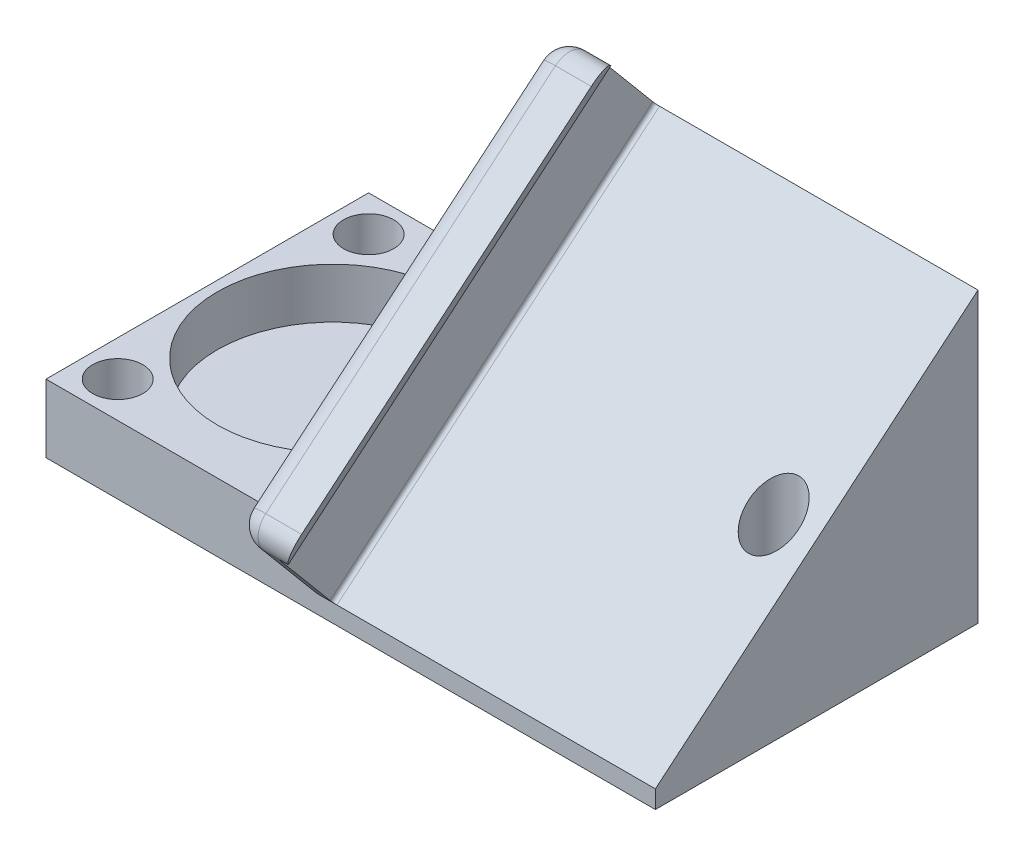
ISO-10303-21;
HEADER;
FILE_DESCRIPTION(('STEP AP214'),'2;1');
FILE_NAME('part.step','',(''),(''),'','','');
FILE_SCHEMA(('AUTOMOTIVE_DESIGN { 1 0 10303 214 1 1 1 1 }'));
ENDSEC;
DATA;
#1=APPLICATION_CONTEXT('core data for automotive mechanical design processes');
#2=APPLICATION_PROTOCOL_DEFINITION('international standard','automotive_design',2000,#1);
#3=PRODUCT_CONTEXT('',#1,'mechanical');
#4=PRODUCT('Part','Part','',(#3));
#5=PRODUCT_RELATED_PRODUCT_CATEGORY('part','',(#4));
#6=PRODUCT_DEFINITION_FORMATION('','',#4);
#7=PRODUCT_DEFINITION_CONTEXT('part definition',#1,'design');
#8=PRODUCT_DEFINITION('design','',#6,#7);
#9=PRODUCT_DEFINITION_SHAPE('','',#8);
#10=(LENGTH_UNIT() NAMED_UNIT(*) SI_UNIT(.MILLI.,.METRE.));
#11=(NAMED_UNIT(*) PLANE_ANGLE_UNIT() SI_UNIT($,.RADIAN.));
#12=(NAMED_UNIT(*) SI_UNIT($,.STERADIAN.) SOLID_ANGLE_UNIT());
#13=UNCERTAINTY_MEASURE_WITH_UNIT(LENGTH_MEASURE(1.E-05),#10,'distance_accuracy_value','');
#14=(GEOMETRIC_REPRESENTATION_CONTEXT(3) GLOBAL_UNCERTAINTY_ASSIGNED_CONTEXT((#13)) GLOBAL_UNIT_ASSIGNED_CONTEXT((#10,
#11,#12)) REPRESENTATION_CONTEXT('',''));
#15=CARTESIAN_POINT('',(0.,0.,0.));
#16=DIRECTION('',(0.,0.,1.));
#17=DIRECTION('',(1.,0.,0.));
#18=AXIS2_PLACEMENT_3D('',#15,#16,#17);
#19=CARTESIAN_POINT('',(-50.,0.,0.));
#20=DIRECTION('',(1.,0.,0.));
#21=DIRECTION('',(0.,0.,-1.));
#22=AXIS2_PLACEMENT_3D('',#19,#20,#21);
#23=PLANE('',#22);
#24=DIRECTION('',(0.,-1.,0.));
#25=VECTOR('',#24,1.);
#26=CARTESIAN_POINT('',(-50.,9.5,0.));
#27=LINE('',#26,#25);
#28=CARTESIAN_POINT('',(-50.,9.5,0.));
#29=VERTEX_POINT('',#28);
#30=CARTESIAN_POINT('',(-50.,7.16717148058123,0.));
#31=VERTEX_POINT('',#30);
#32=EDGE_CURVE('E227',#29,#31,#27,.T.);
#33=ORIENTED_EDGE('',*,*,#32,.T.);
#34=DIRECTION('',(0.,-0.766044443118981,-0.642787609686535));
#35=VECTOR('',#34,1.);
#36=CARTESIAN_POINT('',(-50.,2.96130260697592,-3.52914302062219));
#37=LINE('',#36,#35);
#38=CARTESIAN_POINT('',(-50.,13.6208961464873,5.41531798688147));
#39=VERTEX_POINT('',#38);
#40=EDGE_CURVE('E337',#31,#39,#37,.F.);
#41=ORIENTED_EDGE('',*,*,#40,.T.);
#42=DIRECTION('',(0.,0.642787609686535,-0.766044443118982));
#43=VECTOR('',#42,1.);
#44=CARTESIAN_POINT('',(-50.,10.6595935395114,8.94446100750366));
#45=LINE('',#44,#43);
#46=CARTESIAN_POINT('',(-50.,47.5236538913454,-34.9884153544047));
#47=VERTEX_POINT('',#46);
#48=EDGE_CURVE('E273',#39,#47,#45,.T.);
#49=ORIENTED_EDGE('',*,*,#48,.T.);
#50=DIRECTION('',(0.,-0.766044443118981,-0.642787609686535));
#51=VECTOR('',#50,1.);
#52=CARTESIAN_POINT('',(-50.,38.3311205739176,-42.7018666706431));
#53=LINE('',#52,#51);
#54=CARTESIAN_POINT('',(-50.,39.1675727001786,-42.));
#55=VERTEX_POINT('',#54);
#56=EDGE_CURVE('E311',#47,#55,#53,.T.);
#57=ORIENTED_EDGE('',*,*,#56,.T.);
#58=DIRECTION('',(0.,1.,0.));
#59=VECTOR('',#58,1.);
#60=CARTESIAN_POINT('',(-50.,0.,-42.));
#61=LINE('',#60,#59);
#62=CARTESIAN_POINT('',(-50.,9.5,-42.));
#63=VERTEX_POINT('',#62);
#64=EDGE_CURVE('E309',#55,#63,#61,.F.);
#65=ORIENTED_EDGE('',*,*,#64,.T.);
#66=DIRECTION('',(0.,0.,-1.));
#67=VECTOR('',#66,1.);
#68=CARTESIAN_POINT('',(-50.,9.5,0.));
#69=LINE('',#68,#67);
#70=EDGE_CURVE('E221',#29,#63,#69,.T.);
#71=ORIENTED_EDGE('',*,*,#70,.F.);
#72=EDGE_LOOP('',(#33,#41,#49,#57,#65,#71));
#73=FACE_BOUND('',#72,.T.);
#74=ADVANCED_FACE('F90',(#73),#23,.F.);
#75=CARTESIAN_POINT('',(-50.,2.5,0.));
#76=DIRECTION('',(0.,0.766044443118982,0.642787609686535));
#77=DIRECTION('',(0.,-0.642787609686535,0.766044443118982));
#78=AXIS2_PLACEMENT_3D('',#75,#76,#77);
#79=PLANE('',#78);
#80=CARTESIAN_POINT('',(-6.,21.3797417014886,-22.5));
#81=DIRECTION('',(0.,0.766044443118982,0.642787609686535));
#82=DIRECTION('',(0.,-0.642787609686535,0.766044443118982));
#83=AXIS2_PLACEMENT_3D('',#80,#81,#82);
#84=ELLIPSE('',#83,4.56892551266295,3.5);
#85=CARTESIAN_POINT('',(-6.,18.4428929923681,-19.));
#86=VERTEX_POINT('',#85);
#87=EDGE_CURVE('E287',#86,#86,#84,.F.);
#88=ORIENTED_EDGE('',*,*,#87,.T.);
#89=EDGE_LOOP('',(#88));
#90=FACE_BOUND('',#89,.T.);
#91=DIRECTION('',(1.,0.,0.));
#92=VECTOR('',#91,1.);
#93=CARTESIAN_POINT('',(-50.,40.2594834029772,-45.));
#94=LINE('',#93,#92);
#95=CARTESIAN_POINT('',(-44.42,40.2594834029772,-45.));
#96=VERTEX_POINT('',#95);
#97=CARTESIAN_POINT('',(0.,40.2594834029772,-45.));
#98=VERTEX_POINT('',#97);
#99=EDGE_CURVE('E251',#96,#98,#94,.T.);
#100=ORIENTED_EDGE('',*,*,#99,.F.);
#101=DIRECTION('',(0.,0.642787609686535,-0.766044443118982));
#102=VECTOR('',#101,1.);
#103=CARTESIAN_POINT('',(-44.42,2.5,0.));
#104=LINE('',#103,#102);
#105=CARTESIAN_POINT('',(-44.42,2.5,0.));
#106=VERTEX_POINT('',#105);
#107=EDGE_CURVE('E354',#96,#106,#104,.F.);
#108=ORIENTED_EDGE('',*,*,#107,.T.);
#109=DIRECTION('',(1.,0.,0.));
#110=VECTOR('',#109,1.);
#111=CARTESIAN_POINT('',(-50.,2.5,0.));
#112=LINE('',#111,#110);
#113=CARTESIAN_POINT('',(0.,2.5,0.));
#114=VERTEX_POINT('',#113);
#115=EDGE_CURVE('E256',#106,#114,#112,.T.);
#116=ORIENTED_EDGE('',*,*,#115,.T.);
#117=DIRECTION('',(0.,-0.642787609686535,0.766044443118982));
#118=VECTOR('',#117,1.);
#119=CARTESIAN_POINT('',(0.,2.5,0.));
#120=LINE('',#119,#118);
#121=EDGE_CURVE('E248',#98,#114,#120,.T.);
#122=ORIENTED_EDGE('',*,*,#121,.F.);
#123=EDGE_LOOP('',(#100,#108,#116,#122));
#124=FACE_BOUND('',#123,.T.);
#125=ADVANCED_FACE('F372',(#90,#124),#79,.T.);
#126=CARTESIAN_POINT('',(0.,2.5,0.));
#127=DIRECTION('',(-1.,0.,0.));
#128=DIRECTION('',(0.,0.,1.));
#129=AXIS2_PLACEMENT_3D('',#126,#127,#128);
#130=PLANE('',#129);
#131=DIRECTION('',(0.,0.,-1.));
#132=VECTOR('',#131,1.);
#133=CARTESIAN_POINT('',(0.,0.,0.));
#134=LINE('',#133,#132);
#135=CARTESIAN_POINT('',(0.,0.,0.));
#136=VERTEX_POINT('',#135);
#137=CARTESIAN_POINT('',(0.,0.,-45.));
#138=VERTEX_POINT('',#137);
#139=EDGE_CURVE('E255',#136,#138,#134,.T.);
#140=ORIENTED_EDGE('',*,*,#139,.T.);
#141=DIRECTION('',(0.,-1.,0.));
#142=VECTOR('',#141,1.);
#143=CARTESIAN_POINT('',(0.,2.5,-45.));
#144=LINE('',#143,#142);
#145=EDGE_CURVE('E208',#98,#138,#144,.T.);
#146=ORIENTED_EDGE('',*,*,#145,.F.);
#147=ORIENTED_EDGE('',*,*,#121,.T.);
#148=DIRECTION('',(0.,-1.,0.));
#149=VECTOR('',#148,1.);
#150=CARTESIAN_POINT('',(0.,2.5,0.));
#151=LINE('',#150,#149);
#152=EDGE_CURVE('E265',#114,#136,#151,.T.);
#153=ORIENTED_EDGE('',*,*,#152,.T.);
#154=EDGE_LOOP('',(#140,#146,#147,#153));
#155=FACE_BOUND('',#154,.T.);
#156=ADVANCED_FACE('F382',(#155),#130,.F.);
#157=CARTESIAN_POINT('',(0.,2.5,-45.));
#158=DIRECTION('',(0.,0.,1.));
#159=DIRECTION('',(1.,0.,0.));
#160=AXIS2_PLACEMENT_3D('',#157,#158,#159);
#161=PLANE('',#160);
#162=DIRECTION('',(-1.,0.,0.));
#163=VECTOR('',#162,1.);
#164=CARTESIAN_POINT('',(0.,9.5,-45.));
#165=LINE('',#164,#163);
#166=CARTESIAN_POINT('',(-47.,9.5,-45.));
#167=VERTEX_POINT('',#166);
#168=CARTESIAN_POINT('',(-85.,9.5,-45.));
#169=VERTEX_POINT('',#168);
#170=EDGE_CURVE('E201',#167,#169,#165,.T.);
#171=ORIENTED_EDGE('',*,*,#170,.F.);
#172=DIRECTION('',(0.,1.,0.));
#173=VECTOR('',#172,1.);
#174=CARTESIAN_POINT('',(-47.,2.5,-45.));
#175=LINE('',#174,#173);
#176=CARTESIAN_POINT('',(-47.,40.2594834029772,-45.));
#177=VERTEX_POINT('',#176);
#178=EDGE_CURVE('E313',#167,#177,#175,.T.);
#179=ORIENTED_EDGE('',*,*,#178,.T.);
#180=EDGE_CURVE('E106',#177,#96,#94,.T.);
#181=ORIENTED_EDGE('',*,*,#180,.T.);
#182=ORIENTED_EDGE('',*,*,#99,.T.);
#183=ORIENTED_EDGE('',*,*,#145,.T.);
#184=DIRECTION('',(-1.,0.,0.));
#185=VECTOR('',#184,1.);
#186=CARTESIAN_POINT('',(0.,0.,-45.));
#187=LINE('',#186,#185);
#188=CARTESIAN_POINT('',(-85.,0.,-45.));
#189=VERTEX_POINT('',#188);
#190=EDGE_CURVE('E204',#138,#189,#187,.T.);
#191=ORIENTED_EDGE('',*,*,#190,.T.);
#192=DIRECTION('',(0.,-1.,0.));
#193=VECTOR('',#192,1.);
#194=CARTESIAN_POINT('',(-85.,2.5,-45.));
#195=LINE('',#194,#193);
#196=EDGE_CURVE('E198',#169,#189,#195,.T.);
#197=ORIENTED_EDGE('',*,*,#196,.F.);
#198=EDGE_LOOP('',(#171,#179,#181,#182,#183,#191,#197));
#199=FACE_BOUND('',#198,.T.);
#200=ADVANCED_FACE('F200',(#199),#161,.F.);
#201=CARTESIAN_POINT('',(-85.,2.5,0.));
#202=DIRECTION('',(1.,0.,0.));
#203=DIRECTION('',(0.,0.,-1.));
#204=AXIS2_PLACEMENT_3D('',#201,#202,#203);
#205=PLANE('',#204);
#206=DIRECTION('',(0.,0.,1.));
#207=VECTOR('',#206,1.);
#208=CARTESIAN_POINT('',(-85.,0.,0.));
#209=LINE('',#208,#207);
#210=CARTESIAN_POINT('',(-85.,0.,0.));
#211=VERTEX_POINT('',#210);
#212=EDGE_CURVE('E261',#189,#211,#209,.T.);
#213=ORIENTED_EDGE('',*,*,#212,.T.);
#214=DIRECTION('',(0.,-1.,0.));
#215=VECTOR('',#214,1.);
#216=CARTESIAN_POINT('',(-85.,2.5,0.));
#217=LINE('',#216,#215);
#218=CARTESIAN_POINT('',(-85.,9.5,0.));
#219=VERTEX_POINT('',#218);
#220=EDGE_CURVE('E209',#219,#211,#217,.T.);
#221=ORIENTED_EDGE('',*,*,#220,.F.);
#222=DIRECTION('',(0.,0.,1.));
#223=VECTOR('',#222,1.);
#224=CARTESIAN_POINT('',(-85.,9.5,0.));
#225=LINE('',#224,#223);
#226=EDGE_CURVE('E216',#169,#219,#225,.T.);
#227=ORIENTED_EDGE('',*,*,#226,.F.);
#228=ORIENTED_EDGE('',*,*,#196,.T.);
#229=EDGE_LOOP('',(#213,#221,#227,#228));
#230=FACE_BOUND('',#229,.T.);
#231=ADVANCED_FACE('F223',(#230),#205,.F.);
#232=CARTESIAN_POINT('',(0.,2.5,0.));
#233=DIRECTION('',(0.,0.,-1.));
#234=DIRECTION('',(-1.,0.,0.));
#235=AXIS2_PLACEMENT_3D('',#232,#233,#234);
#236=PLANE('',#235);
#237=DIRECTION('',(1.,0.,0.));
#238=VECTOR('',#237,1.);
#239=CARTESIAN_POINT('',(0.,0.,0.));
#240=LINE('',#239,#238);
#241=EDGE_CURVE('E263',#211,#136,#240,.T.);
#242=ORIENTED_EDGE('',*,*,#241,.T.);
#243=ORIENTED_EDGE('',*,*,#152,.F.);
#244=ORIENTED_EDGE('',*,*,#115,.F.);
#245=CARTESIAN_POINT('',(-47.,2.5,0.));
#246=VERTEX_POINT('',#245);
#247=EDGE_CURVE('E252',#246,#106,#112,.T.);
#248=ORIENTED_EDGE('',*,*,#247,.F.);
#249=CARTESIAN_POINT('',(-47.,7.16717148058125,0.));
#250=DIRECTION('',(0.,0.,-1.));
#251=DIRECTION('',(0.,-1.,0.));
#252=AXIS2_PLACEMENT_3D('',#249,#250,#251);
#253=ELLIPSE('',#252,4.66717148058127,3.);
#254=EDGE_CURVE('E339',#246,#31,#253,.T.);
#255=ORIENTED_EDGE('',*,*,#254,.T.);
#256=ORIENTED_EDGE('',*,*,#32,.F.);
#257=DIRECTION('',(1.,0.,0.));
#258=VECTOR('',#257,1.);
#259=CARTESIAN_POINT('',(0.,9.5,0.));
#260=LINE('',#259,#258);
#261=EDGE_CURVE('E225',#219,#29,#260,.T.);
#262=ORIENTED_EDGE('',*,*,#261,.F.);
#263=ORIENTED_EDGE('',*,*,#220,.T.);
#264=EDGE_LOOP('',(#242,#243,#244,#248,#255,#256,#262,#263));
#265=FACE_BOUND('',#264,.T.);
#266=ADVANCED_FACE('F377',(#265),#236,.F.);
#267=CARTESIAN_POINT('',(0.,0.,0.));
#268=DIRECTION('',(0.,1.,0.));
#269=DIRECTION('',(0.,0.,1.));
#270=AXIS2_PLACEMENT_3D('',#267,#268,#269);
#271=PLANE('',#270);
#272=CARTESIAN_POINT('',(-6.,0.,-22.5));
#273=DIRECTION('',(0.,1.,0.));
#274=DIRECTION('',(0.,0.,1.));
#275=AXIS2_PLACEMENT_3D('',#272,#273,#274);
#276=CIRCLE('',#275,2.1);
#277=CARTESIAN_POINT('',(-6.,0.,-20.4));
#278=VERTEX_POINT('',#277);
#279=EDGE_CURVE('E284',#278,#278,#276,.F.);
#280=ORIENTED_EDGE('',*,*,#279,.F.);
#281=EDGE_LOOP('',(#280));
#282=FACE_BOUND('',#281,.T.);
#283=CARTESIAN_POINT('',(-80.,0.,-40.));
#284=DIRECTION('',(0.,1.,0.));
#285=DIRECTION('',(0.,0.,1.));
#286=AXIS2_PLACEMENT_3D('',#283,#284,#285);
#287=CIRCLE('',#286,2.10000000000001);
#288=CARTESIAN_POINT('',(-80.,0.,-37.9));
#289=VERTEX_POINT('',#288);
#290=EDGE_CURVE('E279',#289,#289,#287,.T.);
#291=ORIENTED_EDGE('',*,*,#290,.T.);
#292=EDGE_LOOP('',(#291));
#293=FACE_BOUND('',#292,.T.);
#294=CARTESIAN_POINT('',(-80.,0.,-4.99999999999999));
#295=DIRECTION('',(0.,1.,0.));
#296=DIRECTION('',(0.,0.,1.));
#297=AXIS2_PLACEMENT_3D('',#294,#295,#296);
#298=CIRCLE('',#297,2.10000000000001);
#299=CARTESIAN_POINT('',(-80.,0.,-2.89999999999998));
#300=VERTEX_POINT('',#299);
#301=EDGE_CURVE('E274',#300,#300,#298,.T.);
#302=ORIENTED_EDGE('',*,*,#301,.T.);
#303=EDGE_LOOP('',(#302));
#304=FACE_BOUND('',#303,.T.);
#305=ORIENTED_EDGE('',*,*,#139,.F.);
#306=ORIENTED_EDGE('',*,*,#241,.F.);
#307=ORIENTED_EDGE('',*,*,#212,.F.);
#308=ORIENTED_EDGE('',*,*,#190,.F.);
#309=EDGE_LOOP('',(#305,#306,#307,#308));
#310=FACE_BOUND('',#309,.T.);
#311=ADVANCED_FACE('F385',(#282,#293,#304,#310),#271,.F.);
#312=CARTESIAN_POINT('',(-45.,11.6925333174277,7.71345131623842));
#313=DIRECTION('',(-1.,0.,0.));
#314=DIRECTION('',(0.,-1.,0.));
#315=AXIS2_PLACEMENT_3D('',#312,#313,#314);
#316=PLANE('',#315);
#317=DIRECTION('',(0.,0.766044443118981,0.642787609686535));
#318=VECTOR('',#317,1.);
#319=CARTESIAN_POINT('',(-45.,49.452016720405,-37.2865486837616));
#320=LINE('',#319,#318);
#321=CARTESIAN_POINT('',(-45.,40.7037891799862,-44.6271831863818));
#322=VERTEX_POINT('',#321);
#323=CARTESIAN_POINT('',(-45.,49.0077109433959,-37.6593654973798));
#324=VERTEX_POINT('',#323);
#325=EDGE_CURVE('E233',#322,#324,#320,.T.);
#326=ORIENTED_EDGE('',*,*,#325,.T.);
#327=DIRECTION('',(0.,0.642787609686535,-0.766044443118982));
#328=VECTOR('',#327,1.);
#329=CARTESIAN_POINT('',(-45.,11.2482275404187,7.34063450262023));
#330=LINE('',#329,#328);
#331=CARTESIAN_POINT('',(-45.,11.2482275404187,7.34063450262023));
#332=VERTEX_POINT('',#331);
#333=EDGE_CURVE('E352',#324,#332,#330,.F.);
#334=ORIENTED_EDGE('',*,*,#333,.T.);
#335=DIRECTION('',(0.,0.766044443118981,0.642787609686535));
#336=VECTOR('',#335,1.);
#337=CARTESIAN_POINT('',(-45.,11.6925333174277,7.71345131623842));
#338=LINE('',#337,#336);
#339=CARTESIAN_POINT('',(-45.,2.94430577700899,0.3728168136182));
#340=VERTEX_POINT('',#339);
#341=EDGE_CURVE('E234',#340,#332,#338,.T.);
#342=ORIENTED_EDGE('',*,*,#341,.F.);
#343=DIRECTION('',(0.,0.642787609686535,-0.766044443118982));
#344=VECTOR('',#343,1.);
#345=CARTESIAN_POINT('',(-45.,2.94430577700899,0.372816813618206));
#346=LINE('',#345,#344);
#347=EDGE_CURVE('E349',#340,#322,#346,.T.);
#348=ORIENTED_EDGE('',*,*,#347,.T.);
#349=EDGE_LOOP('',(#326,#334,#342,#348));
#350=FACE_BOUND('',#349,.T.);
#351=ADVANCED_FACE('F425',(#350),#316,.F.);
#352=CARTESIAN_POINT('',(-43.5,11.6925333174277,7.71345131623842));
#353=DIRECTION('',(0.,0.766044443118981,0.642787609686535));
#354=DIRECTION('',(0.,-0.642787609686535,0.766044443118982));
#355=AXIS2_PLACEMENT_3D('',#352,#353,#354);
#356=PLANE('',#355);
#357=DIRECTION('',(1.,0.,0.));
#358=VECTOR('',#357,1.);
#359=CARTESIAN_POINT('',(-43.5,11.6925333174277,7.71345131623842));
#360=LINE('',#359,#358);
#361=CARTESIAN_POINT('',(-44.42,11.6925333174277,7.71345131623842));
#362=VERTEX_POINT('',#361);
#363=CARTESIAN_POINT('',(-43.5,11.6925333174277,7.71345131623842));
#364=VERTEX_POINT('',#363);
#365=EDGE_CURVE('E237',#362,#364,#360,.T.);
#366=ORIENTED_EDGE('',*,*,#365,.F.);
#367=DIRECTION('',(0.,0.642787609686535,-0.766044443118982));
#368=VECTOR('',#367,1.);
#369=CARTESIAN_POINT('',(-44.42,49.452016720405,-37.2865486837616));
#370=LINE('',#369,#368);
#371=CARTESIAN_POINT('',(-44.42,49.452016720405,-37.2865486837616));
#372=VERTEX_POINT('',#371);
#373=EDGE_CURVE('E341',#362,#372,#370,.T.);
#374=ORIENTED_EDGE('',*,*,#373,.T.);
#375=DIRECTION('',(1.,0.,0.));
#376=VECTOR('',#375,1.);
#377=CARTESIAN_POINT('',(-43.5,49.452016720405,-37.2865486837616));
#378=LINE('',#377,#376);
#379=CARTESIAN_POINT('',(-43.5,49.452016720405,-37.2865486837616));
#380=VERTEX_POINT('',#379);
#381=EDGE_CURVE('E238',#372,#380,#378,.T.);
#382=ORIENTED_EDGE('',*,*,#381,.T.);
#383=DIRECTION('',(0.,0.642787609686535,-0.766044443118981));
#384=VECTOR('',#383,1.);
#385=CARTESIAN_POINT('',(-43.5,11.6925333174277,7.71345131623842));
#386=LINE('',#385,#384);
#387=EDGE_CURVE('E245',#364,#380,#386,.T.);
#388=ORIENTED_EDGE('',*,*,#387,.F.);
#389=EDGE_LOOP('',(#366,#374,#382,#388));
#390=FACE_BOUND('',#389,.T.);
#391=ADVANCED_FACE('F512',(#390),#356,.F.);
#392=CARTESIAN_POINT('',(-42.,13.9906666467847,9.64181414529802));
#393=DIRECTION('',(-0.894427190999915,0.342585489720004,0.28746335807074));
#394=DIRECTION('',(-0.357682690979346,-0.93384318414484,0.));
#395=AXIS2_PLACEMENT_3D('',#392,#393,#394);
#396=PLANE('',#395);
#397=DIRECTION('',(0.,0.642787609686535,-0.766044443118981));
#398=VECTOR('',#397,1.);
#399=CARTESIAN_POINT('',(-42.,13.9906666467847,9.64181414529802));
#400=LINE('',#399,#398);
#401=CARTESIAN_POINT('',(-42.,15.9190294758443,7.34368081594108));
#402=VERTEX_POINT('',#401);
#403=CARTESIAN_POINT('',(-42.,49.8217872207023,-33.060052525345));
#404=VERTEX_POINT('',#403);
#405=EDGE_CURVE('E240',#402,#404,#400,.T.);
#406=ORIENTED_EDGE('',*,*,#405,.F.);
#407=CARTESIAN_POINT('',(-43.5,13.6208961464873,5.41531798688147));
#408=DIRECTION('',(-0.894427190999915,0.342585489720004,0.28746335807074));
#409=DIRECTION('',(-0.447213595499959,-0.685170979440005,-0.574926716141478));
#410=AXIS2_PLACEMENT_3D('',#407,#408,#409);
#411=ELLIPSE('',#410,3.35410196624969,3.);
#412=EDGE_CURVE('E332',#402,#364,#411,.F.);
#413=ORIENTED_EDGE('',*,*,#412,.T.);
#414=ORIENTED_EDGE('',*,*,#387,.T.);
#415=CARTESIAN_POINT('',(-43.5,47.5236538913453,-34.9884153544046));
#416=DIRECTION('',(-0.894427190999915,0.342585489720004,0.28746335807074));
#417=DIRECTION('',(0.447213595499959,0.685170979440005,0.574926716141478));
#418=AXIS2_PLACEMENT_3D('',#415,#416,#417);
#419=ELLIPSE('',#418,3.35410196624969,3.);
#420=EDGE_CURVE('E303',#380,#404,#419,.F.);
#421=ORIENTED_EDGE('',*,*,#420,.T.);
#422=EDGE_LOOP('',(#406,#413,#414,#421));
#423=FACE_BOUND('',#422,.T.);
#424=ADVANCED_FACE('F516',(#423),#396,.F.);
#425=CARTESIAN_POINT('',(-50.,13.9906666467847,9.64181414529802));
#426=DIRECTION('',(0.,-0.766044443118981,-0.642787609686535));
#427=DIRECTION('',(0.,0.642787609686535,-0.766044443118982));
#428=AXIS2_PLACEMENT_3D('',#425,#426,#427);
#429=PLANE('',#428);
#430=DIRECTION('',(0.,0.642787609686535,-0.766044443118982));
#431=VECTOR('',#430,1.);
#432=CARTESIAN_POINT('',(-47.,13.9906666467847,9.64181414529802));
#433=LINE('',#432,#431);
#434=CARTESIAN_POINT('',(-47.,49.8217872207023,-33.0600525253451));
#435=VERTEX_POINT('',#434);
#436=CARTESIAN_POINT('',(-47.,15.9190294758443,7.34368081594108));
#437=VERTEX_POINT('',#436);
#438=EDGE_CURVE('E293',#435,#437,#433,.F.);
#439=ORIENTED_EDGE('',*,*,#438,.T.);
#440=DIRECTION('',(-1.,0.,0.));
#441=VECTOR('',#440,1.);
#442=CARTESIAN_POINT('',(-50.,15.9190294758443,7.34368081594108));
#443=LINE('',#442,#441);
#444=EDGE_CURVE('E330',#437,#402,#443,.F.);
#445=ORIENTED_EDGE('',*,*,#444,.T.);
#446=ORIENTED_EDGE('',*,*,#405,.T.);
#447=DIRECTION('',(-1.,0.,0.));
#448=VECTOR('',#447,1.);
#449=CARTESIAN_POINT('',(-47.,49.8217872207023,-33.060052525345));
#450=LINE('',#449,#448);
#451=EDGE_CURVE('E296',#404,#435,#450,.T.);
#452=ORIENTED_EDGE('',*,*,#451,.T.);
#453=EDGE_LOOP('',(#439,#445,#446,#452));
#454=FACE_BOUND('',#453,.T.);
#455=ADVANCED_FACE('F521',(#454),#429,.F.);
#456=CARTESIAN_POINT('',(0.,1.03293977791632,-1.23100969126524));
#457=DIRECTION('',(0.,0.642787609686535,-0.766044443118981));
#458=DIRECTION('',(0.,0.766044443118981,0.642787609686535));
#459=AXIS2_PLACEMENT_3D('',#456,#457,#458);
#460=PLANE('',#459);
#461=ORIENTED_EDGE('',*,*,#247,.T.);
#462=CARTESIAN_POINT('',(-44.42,2.944305777009,0.372816813618202));
#463=DIRECTION('',(0.,0.642787609686535,-0.766044443118981));
#464=DIRECTION('',(0.,0.766044443118981,0.642787609686535));
#465=AXIS2_PLACEMENT_3D('',#462,#463,#464);
#466=CIRCLE('',#465,0.58);
#467=EDGE_CURVE('E12',#106,#340,#466,.T.);
#468=ORIENTED_EDGE('',*,*,#467,.T.);
#469=ORIENTED_EDGE('',*,*,#341,.T.);
#470=CARTESIAN_POINT('',(-44.42,11.2482275404187,7.34063450262023));
#471=DIRECTION('',(0.,0.642787609686535,-0.766044443118981));
#472=DIRECTION('',(0.,0.766044443118981,0.642787609686535));
#473=AXIS2_PLACEMENT_3D('',#470,#471,#472);
#474=CIRCLE('',#473,0.58);
#475=EDGE_CURVE('E359',#332,#362,#474,.T.);
#476=ORIENTED_EDGE('',*,*,#475,.T.);
#477=DIRECTION('',(-1.,0.,0.));
#478=VECTOR('',#477,1.);
#479=CARTESIAN_POINT('',(0.,11.6925333174277,7.71345131623841));
#480=LINE('',#479,#478);
#481=CARTESIAN_POINT('',(-47.,11.6925333174277,7.71345131623842));
#482=VERTEX_POINT('',#481);
#483=EDGE_CURVE('E328',#362,#482,#480,.T.);
#484=ORIENTED_EDGE('',*,*,#483,.T.);
#485=DIRECTION('',(0.,-0.766044443118981,-0.642787609686535));
#486=VECTOR('',#485,1.);
#487=CARTESIAN_POINT('',(-47.,1.03293977791632,-1.23100969126524));
#488=LINE('',#487,#486);
#489=EDGE_CURVE('E316',#482,#246,#488,.T.);
#490=ORIENTED_EDGE('',*,*,#489,.T.);
#491=EDGE_LOOP('',(#461,#468,#469,#476,#484,#490));
#492=FACE_BOUND('',#491,.T.);
#493=ADVANCED_FACE('F507',(#492),#460,.F.);
#494=CARTESIAN_POINT('',(0.,38.7924231808935,-46.2310096912653));
#495=DIRECTION('',(0.,0.642787609686535,-0.766044443118981));
#496=DIRECTION('',(0.,0.766044443118981,0.642787609686535));
#497=AXIS2_PLACEMENT_3D('',#494,#495,#496);
#498=PLANE('',#497);
#499=DIRECTION('',(0.,-0.766044443118981,-0.642787609686535));
#500=VECTOR('',#499,1.);
#501=CARTESIAN_POINT('',(-47.,49.452016720405,-37.2865486837616));
#502=LINE('',#501,#500);
#503=CARTESIAN_POINT('',(-47.,49.452016720405,-37.2865486837616));
#504=VERTEX_POINT('',#503);
#505=EDGE_CURVE('E299',#177,#504,#502,.F.);
#506=ORIENTED_EDGE('',*,*,#505,.T.);
#507=DIRECTION('',(-1.,0.,0.));
#508=VECTOR('',#507,1.);
#509=CARTESIAN_POINT('',(-42.,49.452016720405,-37.2865486837616));
#510=LINE('',#509,#508);
#511=EDGE_CURVE('E301',#504,#372,#510,.F.);
#512=ORIENTED_EDGE('',*,*,#511,.T.);
#513=CARTESIAN_POINT('',(-44.42,49.0077109433959,-37.6593654973798));
#514=DIRECTION('',(0.,0.642787609686535,-0.766044443118981));
#515=DIRECTION('',(0.,0.766044443118981,0.642787609686535));
#516=AXIS2_PLACEMENT_3D('',#513,#514,#515);
#517=CIRCLE('',#516,0.58);
#518=EDGE_CURVE('E357',#372,#324,#517,.F.);
#519=ORIENTED_EDGE('',*,*,#518,.T.);
#520=ORIENTED_EDGE('',*,*,#325,.F.);
#521=CARTESIAN_POINT('',(-44.42,40.7037891799862,-44.6271831863818));
#522=DIRECTION('',(0.,0.642787609686535,-0.766044443118981));
#523=DIRECTION('',(0.,0.766044443118981,0.642787609686535));
#524=AXIS2_PLACEMENT_3D('',#521,#522,#523);
#525=CIRCLE('',#524,0.58);
#526=EDGE_CURVE('E99',#322,#96,#525,.F.);
#527=ORIENTED_EDGE('',*,*,#526,.T.);
#528=ORIENTED_EDGE('',*,*,#180,.F.);
#529=EDGE_LOOP('',(#506,#512,#519,#520,#527,#528));
#530=FACE_BOUND('',#529,.T.);
#531=ADVANCED_FACE('F365',(#530),#498,.T.);
#532=CARTESIAN_POINT('',(-67.5,9.5,-22.5));
#533=DIRECTION('',(0.,-1.,0.));
#534=DIRECTION('',(0.,0.,-1.));
#535=AXIS2_PLACEMENT_3D('',#532,#533,#534);
#536=CYLINDRICAL_SURFACE('',#535,16.1);
#537=CARTESIAN_POINT('',(-67.5,9.5,-22.5));
#538=DIRECTION('',(0.,1.,0.));
#539=DIRECTION('',(0.,0.,1.));
#540=AXIS2_PLACEMENT_3D('',#537,#538,#539);
#541=CIRCLE('',#540,16.1);
#542=CARTESIAN_POINT('',(-67.5,9.5,-6.39999999999999));
#543=VERTEX_POINT('',#542);
#544=EDGE_CURVE('E277',#543,#543,#541,.T.);
#545=ORIENTED_EDGE('',*,*,#544,.T.);
#546=EDGE_LOOP('',(#545));
#547=FACE_BOUND('',#546,.T.);
#548=CARTESIAN_POINT('',(-67.5,2.5,-22.5));
#549=DIRECTION('',(0.,1.,0.));
#550=DIRECTION('',(0.,0.,1.));
#551=AXIS2_PLACEMENT_3D('',#548,#549,#550);
#552=CIRCLE('',#551,16.1);
#553=CARTESIAN_POINT('',(-67.5,2.5,-6.39999999999999));
#554=VERTEX_POINT('',#553);
#555=EDGE_CURVE('E270',#554,#554,#552,.F.);
#556=ORIENTED_EDGE('',*,*,#555,.T.);
#557=EDGE_LOOP('',(#556));
#558=FACE_BOUND('',#557,.T.);
#559=ADVANCED_FACE('F531',(#547,#558),#536,.F.);
#560=CARTESIAN_POINT('',(0.,9.5,0.));
#561=DIRECTION('',(0.,1.,0.));
#562=DIRECTION('',(0.,0.,1.));
#563=AXIS2_PLACEMENT_3D('',#560,#561,#562);
#564=PLANE('',#563);
#565=CARTESIAN_POINT('',(-80.,9.5,-40.));
#566=DIRECTION('',(0.,1.,0.));
#567=DIRECTION('',(0.,0.,1.));
#568=AXIS2_PLACEMENT_3D('',#565,#566,#567);
#569=CIRCLE('',#568,3.50000000000002);
#570=CARTESIAN_POINT('',(-80.,9.5,-36.5));
#571=VERTEX_POINT('',#570);
#572=EDGE_CURVE('E291',#571,#571,#569,.T.);
#573=ORIENTED_EDGE('',*,*,#572,.F.);
#574=EDGE_LOOP('',(#573));
#575=FACE_BOUND('',#574,.T.);
#576=CARTESIAN_POINT('',(-80.,9.5,-4.99999999999999));
#577=DIRECTION('',(0.,1.,0.));
#578=DIRECTION('',(0.,0.,1.));
#579=AXIS2_PLACEMENT_3D('',#576,#577,#578);
#580=CIRCLE('',#579,3.50000000000002);
#581=CARTESIAN_POINT('',(-80.,9.5,-1.49999999999997));
#582=VERTEX_POINT('',#581);
#583=EDGE_CURVE('E282',#582,#582,#580,.T.);
#584=ORIENTED_EDGE('',*,*,#583,.F.);
#585=EDGE_LOOP('',(#584));
#586=FACE_BOUND('',#585,.T.);
#587=ORIENTED_EDGE('',*,*,#544,.F.);
#588=EDGE_LOOP('',(#587));
#589=FACE_BOUND('',#588,.T.);
#590=ORIENTED_EDGE('',*,*,#70,.T.);
#591=CARTESIAN_POINT('',(-47.,9.5,-42.));
#592=DIRECTION('',(0.,1.,0.));
#593=DIRECTION('',(0.,0.,1.));
#594=AXIS2_PLACEMENT_3D('',#591,#592,#593);
#595=CIRCLE('',#594,3.);
#596=EDGE_CURVE('E219',#63,#167,#595,.F.);
#597=ORIENTED_EDGE('',*,*,#596,.T.);
#598=ORIENTED_EDGE('',*,*,#170,.T.);
#599=ORIENTED_EDGE('',*,*,#226,.T.);
#600=ORIENTED_EDGE('',*,*,#261,.T.);
#601=EDGE_LOOP('',(#590,#597,#598,#599,#600));
#602=FACE_BOUND('',#601,.T.);
#603=ADVANCED_FACE('F214',(#575,#586,#589,#602),#564,.T.);
#604=CARTESIAN_POINT('',(0.,2.5,0.));
#605=DIRECTION('',(0.,1.,0.));
#606=DIRECTION('',(0.,0.,1.));
#607=AXIS2_PLACEMENT_3D('',#604,#605,#606);
#608=PLANE('',#607);
#609=ORIENTED_EDGE('',*,*,#555,.F.);
#610=EDGE_LOOP('',(#609));
#611=FACE_BOUND('',#610,.T.);
#612=ADVANCED_FACE('F434',(#611),#608,.T.);
#613=CARTESIAN_POINT('',(-80.,9.5,-4.99999999999999));
#614=DIRECTION('',(0.,1.,0.));
#615=DIRECTION('',(0.,0.,1.));
#616=AXIS2_PLACEMENT_3D('',#613,#614,#615);
#617=CYLINDRICAL_SURFACE('',#616,2.10000000000001);
#618=CARTESIAN_POINT('',(-80.,4.5,-4.99999999999999));
#619=DIRECTION('',(0.,1.,0.));
#620=DIRECTION('',(0.,0.,1.));
#621=AXIS2_PLACEMENT_3D('',#618,#619,#620);
#622=CIRCLE('',#621,2.10000000000002);
#623=CARTESIAN_POINT('',(-80.,4.5,-2.89999999999997));
#624=VERTEX_POINT('',#623);
#625=EDGE_CURVE('E278',#624,#624,#622,.T.);
#626=ORIENTED_EDGE('',*,*,#625,.T.);
#627=EDGE_LOOP('',(#626));
#628=FACE_BOUND('',#627,.T.);
#629=ORIENTED_EDGE('',*,*,#301,.F.);
#630=EDGE_LOOP('',(#629));
#631=FACE_BOUND('',#630,.T.);
#632=ADVANCED_FACE('F431',(#628,#631),#617,.F.);
#633=CARTESIAN_POINT('',(-77.9,4.5,-4.99999999999999));
#634=DIRECTION('',(0.,-1.,0.));
#635=DIRECTION('',(0.,0.,-1.));
#636=AXIS2_PLACEMENT_3D('',#633,#634,#635);
#637=PLANE('',#636);
#638=ORIENTED_EDGE('',*,*,#625,.F.);
#639=EDGE_LOOP('',(#638));
#640=FACE_BOUND('',#639,.T.);
#641=CARTESIAN_POINT('',(-80.,4.5,-4.99999999999999));
#642=DIRECTION('',(0.,1.,0.));
#643=DIRECTION('',(0.,0.,1.));
#644=AXIS2_PLACEMENT_3D('',#641,#642,#643);
#645=CIRCLE('',#644,3.50000000000002);
#646=CARTESIAN_POINT('',(-80.,4.5,-1.49999999999997));
#647=VERTEX_POINT('',#646);
#648=EDGE_CURVE('E395',#647,#647,#645,.T.);
#649=ORIENTED_EDGE('',*,*,#648,.T.);
#650=EDGE_LOOP('',(#649));
#651=FACE_BOUND('',#650,.T.);
#652=ADVANCED_FACE('F433',(#640,#651),#637,.F.);
#653=CARTESIAN_POINT('',(-80.,9.5,-4.99999999999999));
#654=DIRECTION('',(0.,1.,0.));
#655=DIRECTION('',(0.,0.,1.));
#656=AXIS2_PLACEMENT_3D('',#653,#654,#655);
#657=CYLINDRICAL_SURFACE('',#656,3.50000000000002);
#658=ORIENTED_EDGE('',*,*,#648,.F.);
#659=EDGE_LOOP('',(#658));
#660=FACE_BOUND('',#659,.T.);
#661=ORIENTED_EDGE('',*,*,#583,.T.);
#662=EDGE_LOOP('',(#661));
#663=FACE_BOUND('',#662,.T.);
#664=ADVANCED_FACE('F441',(#660,#663),#657,.F.);
#665=CARTESIAN_POINT('',(-80.,9.5,-40.));
#666=DIRECTION('',(0.,1.,0.));
#667=DIRECTION('',(0.,0.,1.));
#668=AXIS2_PLACEMENT_3D('',#665,#666,#667);
#669=CYLINDRICAL_SURFACE('',#668,2.10000000000001);
#670=CARTESIAN_POINT('',(-80.,4.5,-40.));
#671=DIRECTION('',(0.,1.,0.));
#672=DIRECTION('',(0.,0.,1.));
#673=AXIS2_PLACEMENT_3D('',#670,#671,#672);
#674=CIRCLE('',#673,2.10000000000002);
#675=CARTESIAN_POINT('',(-80.,4.5,-37.9));
#676=VERTEX_POINT('',#675);
#677=EDGE_CURVE('E283',#676,#676,#674,.T.);
#678=ORIENTED_EDGE('',*,*,#677,.T.);
#679=EDGE_LOOP('',(#678));
#680=FACE_BOUND('',#679,.T.);
#681=ORIENTED_EDGE('',*,*,#290,.F.);
#682=EDGE_LOOP('',(#681));
#683=FACE_BOUND('',#682,.T.);
#684=ADVANCED_FACE('F549',(#680,#683),#669,.F.);
#685=CARTESIAN_POINT('',(-77.9,4.5,-40.));
#686=DIRECTION('',(0.,-1.,0.));
#687=DIRECTION('',(0.,0.,-1.));
#688=AXIS2_PLACEMENT_3D('',#685,#686,#687);
#689=PLANE('',#688);
#690=ORIENTED_EDGE('',*,*,#677,.F.);
#691=EDGE_LOOP('',(#690));
#692=FACE_BOUND('',#691,.T.);
#693=CARTESIAN_POINT('',(-80.,4.5,-40.));
#694=DIRECTION('',(0.,1.,0.));
#695=DIRECTION('',(0.,0.,1.));
#696=AXIS2_PLACEMENT_3D('',#693,#694,#695);
#697=CIRCLE('',#696,3.50000000000002);
#698=CARTESIAN_POINT('',(-80.,4.5,-36.5));
#699=VERTEX_POINT('',#698);
#700=EDGE_CURVE('E402',#699,#699,#697,.T.);
#701=ORIENTED_EDGE('',*,*,#700,.T.);
#702=EDGE_LOOP('',(#701));
#703=FACE_BOUND('',#702,.T.);
#704=ADVANCED_FACE('F555',(#692,#703),#689,.F.);
#705=CARTESIAN_POINT('',(-80.,9.5,-40.));
#706=DIRECTION('',(0.,1.,0.));
#707=DIRECTION('',(0.,0.,1.));
#708=AXIS2_PLACEMENT_3D('',#705,#706,#707);
#709=CYLINDRICAL_SURFACE('',#708,3.50000000000002);
#710=ORIENTED_EDGE('',*,*,#700,.F.);
#711=EDGE_LOOP('',(#710));
#712=FACE_BOUND('',#711,.T.);
#713=ORIENTED_EDGE('',*,*,#572,.T.);
#714=EDGE_LOOP('',(#713));
#715=FACE_BOUND('',#714,.T.);
#716=ADVANCED_FACE('F419',(#712,#715),#709,.F.);
#717=CARTESIAN_POINT('',(-6.,-6.51956300556122,-22.5));
#718=DIRECTION('',(0.,-1.,0.));
#719=DIRECTION('',(0.,0.,-1.));
#720=AXIS2_PLACEMENT_3D('',#717,#718,#719);
#721=CYLINDRICAL_SURFACE('',#720,2.1);
#722=CARTESIAN_POINT('',(-6.,6.,-22.5));
#723=DIRECTION('',(0.,-1.,0.));
#724=DIRECTION('',(0.,0.,-1.));
#725=AXIS2_PLACEMENT_3D('',#722,#723,#724);
#726=CIRCLE('',#725,2.1);
#727=CARTESIAN_POINT('',(-6.,6.,-24.6));
#728=VERTEX_POINT('',#727);
#729=EDGE_CURVE('E326',#728,#728,#726,.T.);
#730=ORIENTED_EDGE('',*,*,#729,.F.);
#731=EDGE_LOOP('',(#730));
#732=FACE_BOUND('',#731,.T.);
#733=ORIENTED_EDGE('',*,*,#279,.T.);
#734=EDGE_LOOP('',(#733));
#735=FACE_BOUND('',#734,.T.);
#736=ADVANCED_FACE('F415',(#732,#735),#721,.F.);
#737=CARTESIAN_POINT('',(-6.,-6.51956300556122,-22.5));
#738=DIRECTION('',(0.,-1.,0.));
#739=DIRECTION('',(0.,0.,-1.));
#740=AXIS2_PLACEMENT_3D('',#737,#738,#739);
#741=CYLINDRICAL_SURFACE('',#740,3.5);
#742=ORIENTED_EDGE('',*,*,#87,.F.);
#743=EDGE_LOOP('',(#742));
#744=FACE_BOUND('',#743,.T.);
#745=CARTESIAN_POINT('',(-6.,6.,-22.5));
#746=DIRECTION('',(0.,-1.,0.));
#747=DIRECTION('',(0.,0.,-1.));
#748=AXIS2_PLACEMENT_3D('',#745,#746,#747);
#749=CIRCLE('',#748,3.5);
#750=CARTESIAN_POINT('',(-6.,6.,-26.));
#751=VERTEX_POINT('',#750);
#752=EDGE_CURVE('E288',#751,#751,#749,.T.);
#753=ORIENTED_EDGE('',*,*,#752,.T.);
#754=EDGE_LOOP('',(#753));
#755=FACE_BOUND('',#754,.T.);
#756=ADVANCED_FACE('F418',(#744,#755),#741,.F.);
#757=CARTESIAN_POINT('',(-2.5,6.,-22.5));
#758=DIRECTION('',(0.,1.,0.));
#759=DIRECTION('',(0.,0.,1.));
#760=AXIS2_PLACEMENT_3D('',#757,#758,#759);
#761=PLANE('',#760);
#762=ORIENTED_EDGE('',*,*,#729,.T.);
#763=EDGE_LOOP('',(#762));
#764=FACE_BOUND('',#763,.T.);
#765=ORIENTED_EDGE('',*,*,#752,.F.);
#766=EDGE_LOOP('',(#765));
#767=FACE_BOUND('',#766,.T.);
#768=ADVANCED_FACE('F412',(#764,#767),#761,.T.);
#769=CARTESIAN_POINT('',(-47.,10.6595935395114,8.94446100750366));
#770=DIRECTION('',(0.,0.642787609686535,-0.766044443118982));
#771=DIRECTION('',(0.,0.766044443118981,0.642787609686535));
#772=AXIS2_PLACEMENT_3D('',#769,#770,#771);
#773=CYLINDRICAL_SURFACE('',#772,3.);
#774=ORIENTED_EDGE('',*,*,#48,.F.);
#775=CARTESIAN_POINT('',(-47.,13.6208961464874,5.41531798688147));
#776=DIRECTION('',(0.,0.642787609686535,-0.766044443118982));
#777=DIRECTION('',(0.,0.766044443118981,0.642787609686535));
#778=AXIS2_PLACEMENT_3D('',#775,#776,#777);
#779=CIRCLE('',#778,3.);
#780=EDGE_CURVE('E335',#39,#437,#779,.T.);
#781=ORIENTED_EDGE('',*,*,#780,.T.);
#782=ORIENTED_EDGE('',*,*,#438,.F.);
#783=CARTESIAN_POINT('',(-47.,47.5236538913453,-34.9884153544047));
#784=DIRECTION('',(0.,0.642787609686535,-0.766044443118982));
#785=DIRECTION('',(0.,0.766044443118981,0.642787609686535));
#786=AXIS2_PLACEMENT_3D('',#783,#784,#785);
#787=CIRCLE('',#786,3.);
#788=EDGE_CURVE('E306',#435,#47,#787,.F.);
#789=ORIENTED_EDGE('',*,*,#788,.T.);
#790=EDGE_LOOP('',(#774,#781,#782,#789));
#791=FACE_BOUND('',#790,.T.);
#792=ADVANCED_FACE('F465',(#791),#773,.T.);
#793=CARTESIAN_POINT('',(-47.,2.5,-42.));
#794=DIRECTION('',(0.,1.,0.));
#795=DIRECTION('',(-1.,0.,0.));
#796=AXIS2_PLACEMENT_3D('',#793,#794,#795);
#797=CYLINDRICAL_SURFACE('',#796,3.);
#798=ORIENTED_EDGE('',*,*,#596,.F.);
#799=ORIENTED_EDGE('',*,*,#64,.F.);
#800=CARTESIAN_POINT('',(-47.,39.1675727001786,-42.));
#801=DIRECTION('',(0.,0.939692620785909,0.342020143325666));
#802=DIRECTION('',(0.,0.342020143325666,-0.939692620785909));
#803=AXIS2_PLACEMENT_3D('',#800,#801,#802);
#804=ELLIPSE('',#803,3.19253331742773,3.);
#805=EDGE_CURVE('E323',#177,#55,#804,.T.);
#806=ORIENTED_EDGE('',*,*,#805,.F.);
#807=ORIENTED_EDGE('',*,*,#178,.F.);
#808=EDGE_LOOP('',(#798,#799,#806,#807));
#809=FACE_BOUND('',#808,.T.);
#810=ADVANCED_FACE('F468',(#809),#797,.T.);
#811=CARTESIAN_POINT('',(-47.,36.8640603518339,-43.9328763619083));
#812=DIRECTION('',(0.,0.766044443118981,0.642787609686535));
#813=DIRECTION('',(0.,-0.642787609686535,0.766044443118981));
#814=AXIS2_PLACEMENT_3D('',#811,#812,#813);
#815=CYLINDRICAL_SURFACE('',#814,3.);
#816=ORIENTED_EDGE('',*,*,#805,.T.);
#817=ORIENTED_EDGE('',*,*,#56,.F.);
#818=CARTESIAN_POINT('',(-47.,47.5236538913453,-34.9884153544047));
#819=DIRECTION('',(0.,0.766044443118981,0.642787609686536));
#820=DIRECTION('',(0.,-0.642787609686536,0.766044443118981));
#821=AXIS2_PLACEMENT_3D('',#818,#819,#820);
#822=CIRCLE('',#821,3.);
#823=EDGE_CURVE('E319',#504,#47,#822,.T.);
#824=ORIENTED_EDGE('',*,*,#823,.F.);
#825=ORIENTED_EDGE('',*,*,#505,.F.);
#826=EDGE_LOOP('',(#816,#817,#824,#825));
#827=FACE_BOUND('',#826,.T.);
#828=ADVANCED_FACE('F478',(#827),#815,.T.);
#829=CARTESIAN_POINT('',(-47.,47.5236538913453,-34.9884153544047));
#830=DIRECTION('',(0.,0.642787609686535,-0.766044443118981));
#831=DIRECTION('',(0.,0.766044443118981,0.642787609686535));
#832=AXIS2_PLACEMENT_3D('',#829,#830,#831);
#833=SPHERICAL_SURFACE('',#832,3.);
#834=ORIENTED_EDGE('',*,*,#823,.T.);
#835=ORIENTED_EDGE('',*,*,#788,.F.);
#836=CARTESIAN_POINT('',(-47.,47.5236538913453,-34.9884153544047));
#837=DIRECTION('',(1.,0.,0.));
#838=DIRECTION('',(0.,0.,-1.));
#839=AXIS2_PLACEMENT_3D('',#836,#837,#838);
#840=CIRCLE('',#839,3.);
#841=EDGE_CURVE('E317',#504,#435,#840,.T.);
#842=ORIENTED_EDGE('',*,*,#841,.F.);
#843=EDGE_LOOP('',(#834,#835,#842));
#844=FACE_BOUND('',#843,.T.);
#845=ADVANCED_FACE('F474',(#844),#833,.T.);
#846=CARTESIAN_POINT('',(-50.,47.5236538913453,-34.9884153544046));
#847=DIRECTION('',(1.,0.,0.));
#848=DIRECTION('',(0.,0.,-1.));
#849=AXIS2_PLACEMENT_3D('',#846,#847,#848);
#850=CYLINDRICAL_SURFACE('',#849,3.);
#851=ORIENTED_EDGE('',*,*,#381,.F.);
#852=ORIENTED_EDGE('',*,*,#511,.F.);
#853=ORIENTED_EDGE('',*,*,#841,.T.);
#854=ORIENTED_EDGE('',*,*,#451,.F.);
#855=ORIENTED_EDGE('',*,*,#420,.F.);
#856=EDGE_LOOP('',(#851,#852,#853,#854,#855));
#857=FACE_BOUND('',#856,.T.);
#858=ADVANCED_FACE('F470',(#857),#850,.T.);
#859=CARTESIAN_POINT('',(-47.,2.96130260697592,-3.52914302062219));
#860=DIRECTION('',(0.,-0.766044443118981,-0.642787609686535));
#861=DIRECTION('',(0.,0.642787609686535,-0.766044443118981));
#862=AXIS2_PLACEMENT_3D('',#859,#860,#861);
#863=CYLINDRICAL_SURFACE('',#862,3.);
#864=CARTESIAN_POINT('',(-47.,13.6208961464873,5.41531798688147));
#865=DIRECTION('',(0.,0.766044443118982,0.642787609686534));
#866=DIRECTION('',(0.,-0.642787609686534,0.766044443118982));
#867=AXIS2_PLACEMENT_3D('',#864,#865,#866);
#868=CIRCLE('',#867,3.);
#869=EDGE_CURVE('E320',#39,#482,#868,.T.);
#870=ORIENTED_EDGE('',*,*,#869,.F.);
#871=ORIENTED_EDGE('',*,*,#40,.F.);
#872=ORIENTED_EDGE('',*,*,#254,.F.);
#873=ORIENTED_EDGE('',*,*,#489,.F.);
#874=EDGE_LOOP('',(#870,#871,#872,#873));
#875=FACE_BOUND('',#874,.T.);
#876=ADVANCED_FACE('F473',(#875),#863,.T.);
#877=CARTESIAN_POINT('',(-47.,13.6208961464874,5.41531798688147));
#878=DIRECTION('',(0.,0.642787609686535,-0.766044443118981));
#879=DIRECTION('',(0.,0.766044443118981,0.642787609686535));
#880=AXIS2_PLACEMENT_3D('',#877,#878,#879);
#881=SPHERICAL_SURFACE('',#880,3.);
#882=ORIENTED_EDGE('',*,*,#780,.F.);
#883=ORIENTED_EDGE('',*,*,#869,.T.);
#884=CARTESIAN_POINT('',(-47.,13.6208961464874,5.41531798688147));
#885=DIRECTION('',(1.,0.,0.));
#886=DIRECTION('',(0.,0.,-1.));
#887=AXIS2_PLACEMENT_3D('',#884,#885,#886);
#888=CIRCLE('',#887,3.);
#889=EDGE_CURVE('E342',#437,#482,#888,.T.);
#890=ORIENTED_EDGE('',*,*,#889,.F.);
#891=EDGE_LOOP('',(#882,#883,#890));
#892=FACE_BOUND('',#891,.T.);
#893=ADVANCED_FACE('F490',(#892),#881,.T.);
#894=CARTESIAN_POINT('',(0.,13.6208961464873,5.41531798688147));
#895=DIRECTION('',(-1.,0.,0.));
#896=DIRECTION('',(0.,0.,1.));
#897=AXIS2_PLACEMENT_3D('',#894,#895,#896);
#898=CYLINDRICAL_SURFACE('',#897,3.);
#899=ORIENTED_EDGE('',*,*,#412,.F.);
#900=ORIENTED_EDGE('',*,*,#444,.F.);
#901=ORIENTED_EDGE('',*,*,#889,.T.);
#902=ORIENTED_EDGE('',*,*,#483,.F.);
#903=ORIENTED_EDGE('',*,*,#365,.T.);
#904=EDGE_LOOP('',(#899,#900,#901,#902,#903));
#905=FACE_BOUND('',#904,.T.);
#906=ADVANCED_FACE('F486',(#905),#898,.T.);
#907=CARTESIAN_POINT('',(-44.42,11.2482275404187,7.34063450262023));
#908=DIRECTION('',(0.,-0.642787609686535,0.766044443118982));
#909=DIRECTION('',(0.,-0.766044443118981,-0.642787609686535));
#910=AXIS2_PLACEMENT_3D('',#907,#908,#909);
#911=CYLINDRICAL_SURFACE('',#910,0.58);
#912=ORIENTED_EDGE('',*,*,#475,.F.);
#913=ORIENTED_EDGE('',*,*,#333,.F.);
#914=ORIENTED_EDGE('',*,*,#518,.F.);
#915=ORIENTED_EDGE('',*,*,#373,.F.);
#916=EDGE_LOOP('',(#912,#913,#914,#915));
#917=FACE_BOUND('',#916,.T.);
#918=ADVANCED_FACE('F489',(#917),#911,.F.);
#919=CARTESIAN_POINT('',(-44.42,2.944305777009,0.372816813618207));
#920=DIRECTION('',(0.,0.642787609686535,-0.766044443118982));
#921=DIRECTION('',(0.,0.766044443118982,0.642787609686535));
#922=AXIS2_PLACEMENT_3D('',#919,#920,#921);
#923=CYLINDRICAL_SURFACE('',#922,0.58);
#924=ORIENTED_EDGE('',*,*,#467,.F.);
#925=ORIENTED_EDGE('',*,*,#107,.F.);
#926=ORIENTED_EDGE('',*,*,#526,.F.);
#927=ORIENTED_EDGE('',*,*,#347,.F.);
#928=EDGE_LOOP('',(#924,#925,#926,#927));
#929=FACE_BOUND('',#928,.T.);
#930=ADVANCED_FACE('F92',(#929),#923,.F.);
#931=CLOSED_SHELL('',(#74,#125,#156,#200,#231,#266,#311,#351,#391,#424,#455,#493,#531,#559,#603,
#612,#632,#652,#664,#684,#704,#716,#736,#756,#768,#792,#810,#828,#845,#858,#876,#893,#906,#918,#930));
#932=MANIFOLD_SOLID_BREP('B2',#931);
#933=ADVANCED_BREP_SHAPE_REPRESENTATION('',(#18,#932),#14);
#934=SHAPE_DEFINITION_REPRESENTATION(#9,#933);
ENDSEC;
END-ISO-10303-21;
